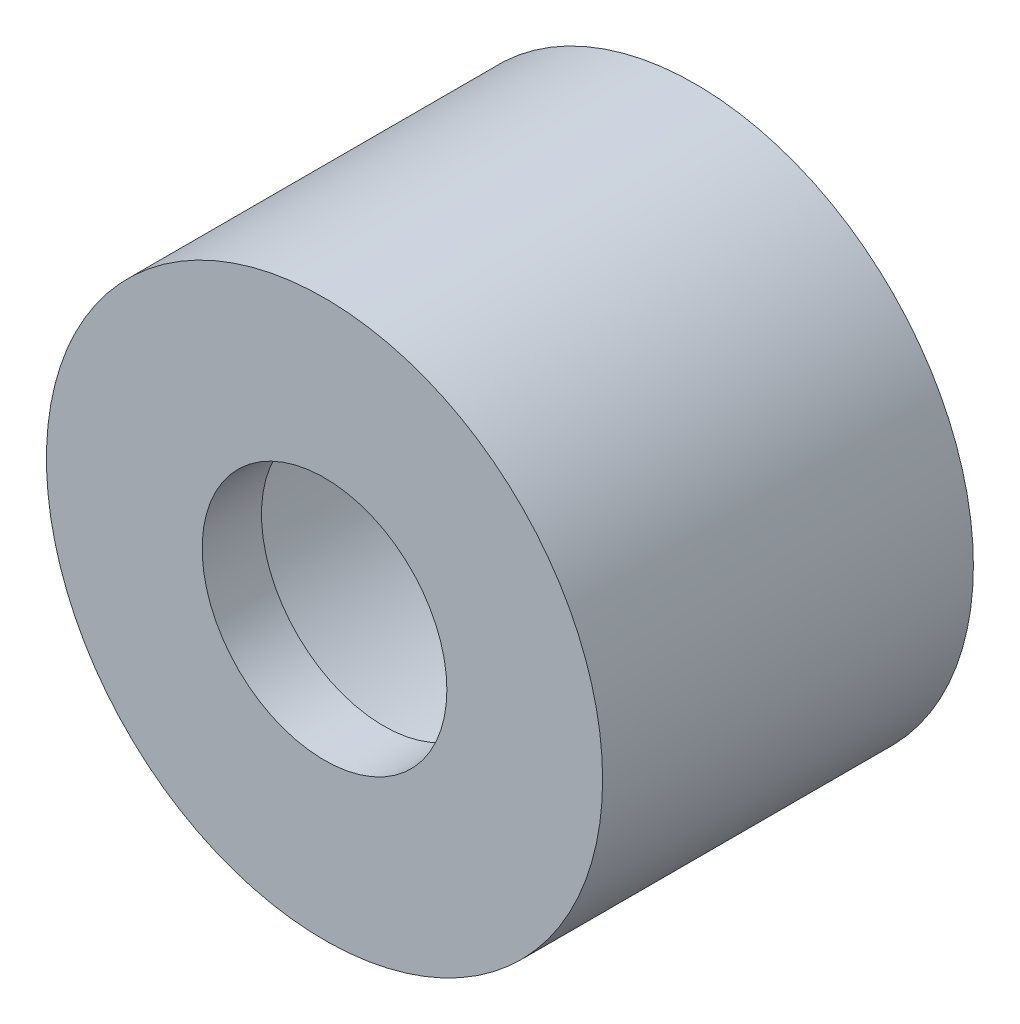
ISO-10303-21;
HEADER;
FILE_DESCRIPTION(('STEP AP214'),'2;1');
FILE_NAME('part.step','',(''),(''),'','','');
FILE_SCHEMA(('AUTOMOTIVE_DESIGN { 1 0 10303 214 1 1 1 1 }'));
ENDSEC;
DATA;
#1=APPLICATION_CONTEXT('core data for automotive mechanical design processes');
#2=APPLICATION_PROTOCOL_DEFINITION('international standard','automotive_design',2000,#1);
#3=PRODUCT_CONTEXT('',#1,'mechanical');
#4=PRODUCT('Part','Part','',(#3));
#5=PRODUCT_RELATED_PRODUCT_CATEGORY('part','',(#4));
#6=PRODUCT_DEFINITION_FORMATION('','',#4);
#7=PRODUCT_DEFINITION_CONTEXT('part definition',#1,'design');
#8=PRODUCT_DEFINITION('design','',#6,#7);
#9=PRODUCT_DEFINITION_SHAPE('','',#8);
#10=(LENGTH_UNIT() NAMED_UNIT(*) SI_UNIT(.MILLI.,.METRE.));
#11=(NAMED_UNIT(*) PLANE_ANGLE_UNIT() SI_UNIT($,.RADIAN.));
#12=(NAMED_UNIT(*) SI_UNIT($,.STERADIAN.) SOLID_ANGLE_UNIT());
#13=UNCERTAINTY_MEASURE_WITH_UNIT(LENGTH_MEASURE(1.E-05),#10,'distance_accuracy_value','');
#14=(GEOMETRIC_REPRESENTATION_CONTEXT(3) GLOBAL_UNCERTAINTY_ASSIGNED_CONTEXT((#13)) GLOBAL_UNIT_ASSIGNED_CONTEXT((#10,
#11,#12)) REPRESENTATION_CONTEXT('',''));
#15=CARTESIAN_POINT('',(0.,0.,0.));
#16=DIRECTION('',(0.,0.,1.));
#17=DIRECTION('',(1.,0.,0.));
#18=AXIS2_PLACEMENT_3D('',#15,#16,#17);
#19=CARTESIAN_POINT('',(0.,0.,10.));
#20=DIRECTION('',(0.,0.,-1.));
#21=DIRECTION('',(-1.,0.,0.));
#22=AXIS2_PLACEMENT_3D('',#19,#20,#21);
#23=PLANE('',#22);
#24=CARTESIAN_POINT('',(0.,0.,10.));
#25=DIRECTION('',(0.,0.,1.));
#26=DIRECTION('',(1.,0.,0.));
#27=AXIS2_PLACEMENT_3D('',#24,#25,#26);
#28=CIRCLE('',#27,7.5);
#29=CARTESIAN_POINT('',(7.5,0.,10.));
#30=VERTEX_POINT('',#29);
#31=EDGE_CURVE('E46',#30,#30,#28,.T.);
#32=ORIENTED_EDGE('',*,*,#31,.T.);
#33=EDGE_LOOP('',(#32));
#34=FACE_BOUND('',#33,.T.);
#35=CARTESIAN_POINT('',(0.,0.,10.));
#36=DIRECTION('',(0.,0.,1.));
#37=DIRECTION('',(1.,0.,0.));
#38=AXIS2_PLACEMENT_3D('',#35,#36,#37);
#39=CIRCLE('',#38,3.3);
#40=CARTESIAN_POINT('',(3.3,0.,10.));
#41=VERTEX_POINT('',#40);
#42=EDGE_CURVE('E95',#41,#41,#39,.T.);
#43=ORIENTED_EDGE('',*,*,#42,.F.);
#44=EDGE_LOOP('',(#43));
#45=FACE_BOUND('',#44,.T.);
#46=ADVANCED_FACE('F85',(#34,#45),#23,.F.);
#47=CARTESIAN_POINT('',(0.,7.5,0.));
#48=DIRECTION('',(0.,0.,1.));
#49=DIRECTION('',(1.,0.,0.));
#50=AXIS2_PLACEMENT_3D('',#47,#48,#49);
#51=PLANE('',#50);
#52=CARTESIAN_POINT('',(0.,0.,0.));
#53=DIRECTION('',(0.,0.,1.));
#54=DIRECTION('',(1.,0.,0.));
#55=AXIS2_PLACEMENT_3D('',#52,#53,#54);
#56=CIRCLE('',#55,7.5);
#57=CARTESIAN_POINT('',(7.5,0.,0.));
#58=VERTEX_POINT('',#57);
#59=EDGE_CURVE('E91',#58,#58,#56,.T.);
#60=ORIENTED_EDGE('',*,*,#59,.F.);
#61=EDGE_LOOP('',(#60));
#62=FACE_BOUND('',#61,.T.);
#63=CARTESIAN_POINT('',(0.,0.,0.));
#64=DIRECTION('',(0.,0.,1.));
#65=DIRECTION('',(1.,0.,0.));
#66=AXIS2_PLACEMENT_3D('',#63,#64,#65);
#67=CIRCLE('',#66,5.5);
#68=CARTESIAN_POINT('',(5.5,0.,0.));
#69=VERTEX_POINT('',#68);
#70=EDGE_CURVE('E107',#69,#69,#67,.T.);
#71=ORIENTED_EDGE('',*,*,#70,.T.);
#72=EDGE_LOOP('',(#71));
#73=FACE_BOUND('',#72,.T.);
#74=ADVANCED_FACE('F111',(#62,#73),#51,.F.);
#75=CARTESIAN_POINT('',(0.,0.,0.));
#76=DIRECTION('',(0.,0.,1.));
#77=DIRECTION('',(1.,0.,0.));
#78=AXIS2_PLACEMENT_3D('',#75,#76,#77);
#79=CYLINDRICAL_SURFACE('',#78,7.5);
#80=ORIENTED_EDGE('',*,*,#31,.F.);
#81=EDGE_LOOP('',(#80));
#82=FACE_BOUND('',#81,.T.);
#83=ORIENTED_EDGE('',*,*,#59,.T.);
#84=EDGE_LOOP('',(#83));
#85=FACE_BOUND('',#84,.T.);
#86=ADVANCED_FACE('F128',(#82,#85),#79,.T.);
#87=CARTESIAN_POINT('',(0.,0.,0.));
#88=DIRECTION('',(0.,0.,1.));
#89=DIRECTION('',(1.,0.,0.));
#90=AXIS2_PLACEMENT_3D('',#87,#88,#89);
#91=CYLINDRICAL_SURFACE('',#90,3.3);
#92=ORIENTED_EDGE('',*,*,#42,.T.);
#93=EDGE_LOOP('',(#92));
#94=FACE_BOUND('',#93,.T.);
#95=CARTESIAN_POINT('',(0.,0.,8.4));
#96=DIRECTION('',(0.,0.,1.));
#97=DIRECTION('',(1.,0.,0.));
#98=AXIS2_PLACEMENT_3D('',#95,#96,#97);
#99=CIRCLE('',#98,3.3);
#100=CARTESIAN_POINT('',(3.3,0.,8.4));
#101=VERTEX_POINT('',#100);
#102=EDGE_CURVE('E99',#101,#101,#99,.T.);
#103=ORIENTED_EDGE('',*,*,#102,.F.);
#104=EDGE_LOOP('',(#103));
#105=FACE_BOUND('',#104,.T.);
#106=ADVANCED_FACE('F121',(#94,#105),#91,.F.);
#107=CARTESIAN_POINT('',(0.,3.3,8.4));
#108=DIRECTION('',(0.,0.,-1.));
#109=DIRECTION('',(-1.,0.,0.));
#110=AXIS2_PLACEMENT_3D('',#107,#108,#109);
#111=PLANE('',#110);
#112=ORIENTED_EDGE('',*,*,#102,.T.);
#113=EDGE_LOOP('',(#112));
#114=FACE_BOUND('',#113,.T.);
#115=CARTESIAN_POINT('',(0.,0.,8.4));
#116=DIRECTION('',(0.,0.,1.));
#117=DIRECTION('',(1.,0.,0.));
#118=AXIS2_PLACEMENT_3D('',#115,#116,#117);
#119=CIRCLE('',#118,5.5);
#120=CARTESIAN_POINT('',(5.5,0.,8.4));
#121=VERTEX_POINT('',#120);
#122=EDGE_CURVE('E104',#121,#121,#119,.T.);
#123=ORIENTED_EDGE('',*,*,#122,.F.);
#124=EDGE_LOOP('',(#123));
#125=FACE_BOUND('',#124,.T.);
#126=ADVANCED_FACE('F115',(#114,#125),#111,.T.);
#127=CARTESIAN_POINT('',(0.,0.,0.));
#128=DIRECTION('',(0.,0.,1.));
#129=DIRECTION('',(1.,0.,0.));
#130=AXIS2_PLACEMENT_3D('',#127,#128,#129);
#131=CYLINDRICAL_SURFACE('',#130,5.5);
#132=ORIENTED_EDGE('',*,*,#122,.T.);
#133=EDGE_LOOP('',(#132));
#134=FACE_BOUND('',#133,.T.);
#135=ORIENTED_EDGE('',*,*,#70,.F.);
#136=EDGE_LOOP('',(#135));
#137=FACE_BOUND('',#136,.T.);
#138=ADVANCED_FACE('F113',(#134,#137),#131,.F.);
#139=CLOSED_SHELL('',(#46,#74,#86,#106,#126,#138));
#140=MANIFOLD_SOLID_BREP('B6',#139);
#141=ADVANCED_BREP_SHAPE_REPRESENTATION('',(#18,#140),#14);
#142=SHAPE_DEFINITION_REPRESENTATION(#9,#141);
ENDSEC;
END-ISO-10303-21;
